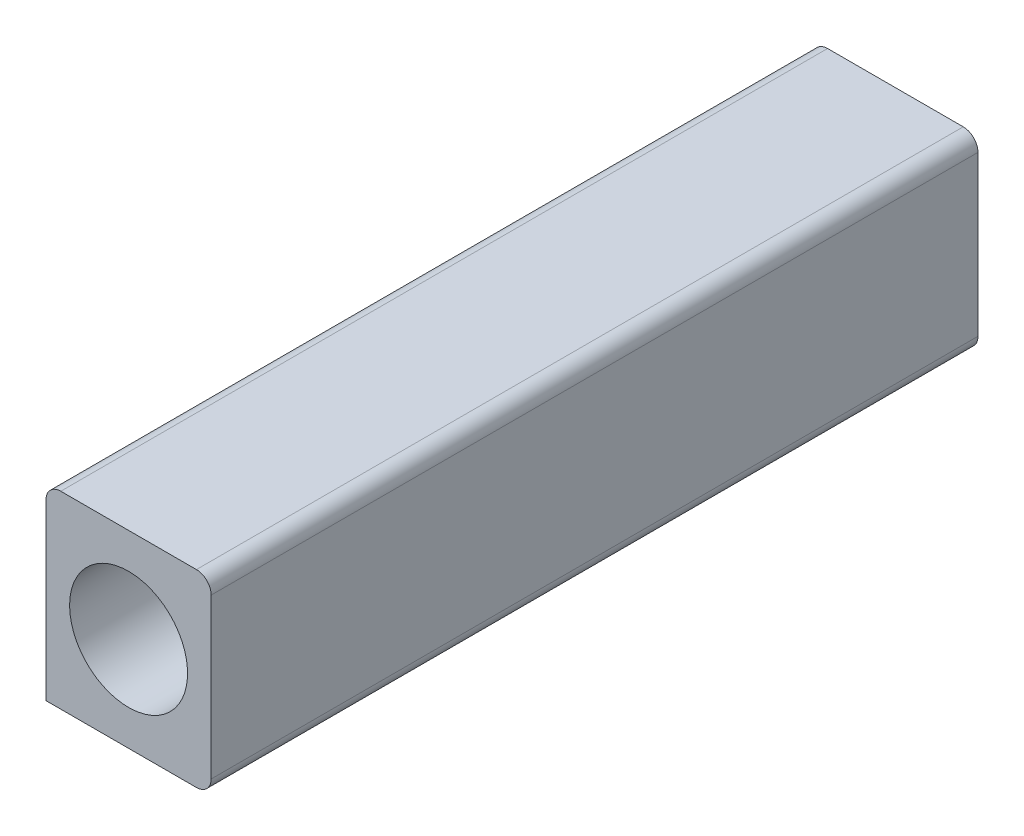
ISO-10303-21;
HEADER;
FILE_DESCRIPTION(('STEP AP214'),'2;1');
FILE_NAME('part.step','',(''),(''),'','','');
FILE_SCHEMA(('AUTOMOTIVE_DESIGN { 1 0 10303 214 1 1 1 1 }'));
ENDSEC;
DATA;
#1=APPLICATION_CONTEXT('core data for automotive mechanical design processes');
#2=APPLICATION_PROTOCOL_DEFINITION('international standard','automotive_design',2000,#1);
#3=PRODUCT_CONTEXT('',#1,'mechanical');
#4=PRODUCT('Part','Part','',(#3));
#5=PRODUCT_RELATED_PRODUCT_CATEGORY('part','',(#4));
#6=PRODUCT_DEFINITION_FORMATION('','',#4);
#7=PRODUCT_DEFINITION_CONTEXT('part definition',#1,'design');
#8=PRODUCT_DEFINITION('design','',#6,#7);
#9=PRODUCT_DEFINITION_SHAPE('','',#8);
#10=(LENGTH_UNIT() NAMED_UNIT(*) SI_UNIT(.MILLI.,.METRE.));
#11=(NAMED_UNIT(*) PLANE_ANGLE_UNIT() SI_UNIT($,.RADIAN.));
#12=(NAMED_UNIT(*) SI_UNIT($,.STERADIAN.) SOLID_ANGLE_UNIT());
#13=UNCERTAINTY_MEASURE_WITH_UNIT(LENGTH_MEASURE(1.E-05),#10,'distance_accuracy_value','');
#14=(GEOMETRIC_REPRESENTATION_CONTEXT(3) GLOBAL_UNCERTAINTY_ASSIGNED_CONTEXT((#13)) GLOBAL_UNIT_ASSIGNED_CONTEXT((#10,
#11,#12)) REPRESENTATION_CONTEXT('',''));
#15=CARTESIAN_POINT('',(0.,0.,0.));
#16=DIRECTION('',(0.,0.,1.));
#17=DIRECTION('',(1.,0.,0.));
#18=AXIS2_PLACEMENT_3D('',#15,#16,#17);
#19=CARTESIAN_POINT('',(-28.,32.,260.));
#20=DIRECTION('',(1.,0.,0.));
#21=DIRECTION('',(0.,0.,-1.));
#22=AXIS2_PLACEMENT_3D('',#19,#20,#21);
#23=PLANE('',#22);
#24=DIRECTION('',(0.,-1.,0.));
#25=VECTOR('',#24,1.);
#26=CARTESIAN_POINT('',(-28.,32.,260.));
#27=LINE('',#26,#25);
#28=CARTESIAN_POINT('',(-28.,27.,260.));
#29=VERTEX_POINT('',#28);
#30=CARTESIAN_POINT('',(-28.,-32.,260.));
#31=VERTEX_POINT('',#30);
#32=EDGE_CURVE('E97',#29,#31,#27,.T.);
#33=ORIENTED_EDGE('',*,*,#32,.F.);
#34=DIRECTION('',(0.,0.,-1.));
#35=VECTOR('',#34,1.);
#36=CARTESIAN_POINT('',(-28.,27.,260.));
#37=LINE('',#36,#35);
#38=CARTESIAN_POINT('',(-28.,27.,0.));
#39=VERTEX_POINT('',#38);
#40=EDGE_CURVE('E144',#29,#39,#37,.T.);
#41=ORIENTED_EDGE('',*,*,#40,.T.);
#42=DIRECTION('',(0.,-1.,0.));
#43=VECTOR('',#42,1.);
#44=CARTESIAN_POINT('',(-28.,32.,0.));
#45=LINE('',#44,#43);
#46=CARTESIAN_POINT('',(-28.,-32.,0.));
#47=VERTEX_POINT('',#46);
#48=EDGE_CURVE('E120',#39,#47,#45,.T.);
#49=ORIENTED_EDGE('',*,*,#48,.T.);
#50=DIRECTION('',(0.,0.,-1.));
#51=VECTOR('',#50,1.);
#52=CARTESIAN_POINT('',(-28.,-32.,260.));
#53=LINE('',#52,#51);
#54=EDGE_CURVE('E114',#31,#47,#53,.T.);
#55=ORIENTED_EDGE('',*,*,#54,.F.);
#56=EDGE_LOOP('',(#33,#41,#49,#55));
#57=FACE_BOUND('',#56,.T.);
#58=ADVANCED_FACE('F39',(#57),#23,.F.);
#59=CARTESIAN_POINT('',(-28.,-32.,260.));
#60=DIRECTION('',(0.,1.,0.));
#61=DIRECTION('',(0.,0.,1.));
#62=AXIS2_PLACEMENT_3D('',#59,#60,#61);
#63=PLANE('',#62);
#64=DIRECTION('',(1.,0.,0.));
#65=VECTOR('',#64,1.);
#66=CARTESIAN_POINT('',(-28.,-32.,0.));
#67=LINE('',#66,#65);
#68=CARTESIAN_POINT('',(23.,-32.,0.));
#69=VERTEX_POINT('',#68);
#70=EDGE_CURVE('E155',#47,#69,#67,.T.);
#71=ORIENTED_EDGE('',*,*,#70,.T.);
#72=DIRECTION('',(0.,0.,-1.));
#73=VECTOR('',#72,1.);
#74=CARTESIAN_POINT('',(23.,-32.,260.));
#75=LINE('',#74,#73);
#76=CARTESIAN_POINT('',(23.,-32.,260.));
#77=VERTEX_POINT('',#76);
#78=EDGE_CURVE('E116',#69,#77,#75,.F.);
#79=ORIENTED_EDGE('',*,*,#78,.T.);
#80=DIRECTION('',(1.,0.,0.));
#81=VECTOR('',#80,1.);
#82=CARTESIAN_POINT('',(-28.,-32.,260.));
#83=LINE('',#82,#81);
#84=EDGE_CURVE('E100',#31,#77,#83,.T.);
#85=ORIENTED_EDGE('',*,*,#84,.F.);
#86=ORIENTED_EDGE('',*,*,#54,.T.);
#87=EDGE_LOOP('',(#71,#79,#85,#86));
#88=FACE_BOUND('',#87,.T.);
#89=ADVANCED_FACE('F113',(#88),#63,.F.);
#90=CARTESIAN_POINT('',(28.,-32.,260.));
#91=DIRECTION('',(-1.,0.,0.));
#92=DIRECTION('',(0.,0.,1.));
#93=AXIS2_PLACEMENT_3D('',#90,#91,#92);
#94=PLANE('',#93);
#95=DIRECTION('',(0.,1.,0.));
#96=VECTOR('',#95,1.);
#97=CARTESIAN_POINT('',(28.,-32.,260.));
#98=LINE('',#97,#96);
#99=CARTESIAN_POINT('',(28.,-27.,260.));
#100=VERTEX_POINT('',#99);
#101=CARTESIAN_POINT('',(28.,27.,260.));
#102=VERTEX_POINT('',#101);
#103=EDGE_CURVE('E117',#100,#102,#98,.T.);
#104=ORIENTED_EDGE('',*,*,#103,.F.);
#105=DIRECTION('',(0.,0.,-1.));
#106=VECTOR('',#105,1.);
#107=CARTESIAN_POINT('',(28.,-27.,260.));
#108=LINE('',#107,#106);
#109=CARTESIAN_POINT('',(28.,-27.,0.));
#110=VERTEX_POINT('',#109);
#111=EDGE_CURVE('E125',#100,#110,#108,.T.);
#112=ORIENTED_EDGE('',*,*,#111,.T.);
#113=DIRECTION('',(0.,1.,0.));
#114=VECTOR('',#113,1.);
#115=CARTESIAN_POINT('',(28.,-32.,0.));
#116=LINE('',#115,#114);
#117=CARTESIAN_POINT('',(28.,27.,0.));
#118=VERTEX_POINT('',#117);
#119=EDGE_CURVE('E154',#110,#118,#116,.T.);
#120=ORIENTED_EDGE('',*,*,#119,.T.);
#121=DIRECTION('',(0.,0.,-1.));
#122=VECTOR('',#121,1.);
#123=CARTESIAN_POINT('',(28.,27.,260.));
#124=LINE('',#123,#122);
#125=EDGE_CURVE('E122',#118,#102,#124,.F.);
#126=ORIENTED_EDGE('',*,*,#125,.T.);
#127=EDGE_LOOP('',(#104,#112,#120,#126));
#128=FACE_BOUND('',#127,.T.);
#129=ADVANCED_FACE('F190',(#128),#94,.F.);
#130=CARTESIAN_POINT('',(28.,32.,260.));
#131=DIRECTION('',(0.,-1.,0.));
#132=DIRECTION('',(0.,0.,-1.));
#133=AXIS2_PLACEMENT_3D('',#130,#131,#132);
#134=PLANE('',#133);
#135=DIRECTION('',(-1.,0.,0.));
#136=VECTOR('',#135,1.);
#137=CARTESIAN_POINT('',(28.,32.,0.));
#138=LINE('',#137,#136);
#139=CARTESIAN_POINT('',(23.,32.,0.));
#140=VERTEX_POINT('',#139);
#141=CARTESIAN_POINT('',(-23.,32.,0.));
#142=VERTEX_POINT('',#141);
#143=EDGE_CURVE('E108',#140,#142,#138,.T.);
#144=ORIENTED_EDGE('',*,*,#143,.T.);
#145=DIRECTION('',(0.,0.,-1.));
#146=VECTOR('',#145,1.);
#147=CARTESIAN_POINT('',(-23.,32.,260.));
#148=LINE('',#147,#146);
#149=CARTESIAN_POINT('',(-23.,32.,260.));
#150=VERTEX_POINT('',#149);
#151=EDGE_CURVE('E11',#142,#150,#148,.F.);
#152=ORIENTED_EDGE('',*,*,#151,.T.);
#153=DIRECTION('',(-1.,0.,0.));
#154=VECTOR('',#153,1.);
#155=CARTESIAN_POINT('',(28.,32.,260.));
#156=LINE('',#155,#154);
#157=CARTESIAN_POINT('',(23.,32.,260.));
#158=VERTEX_POINT('',#157);
#159=EDGE_CURVE('E123',#158,#150,#156,.T.);
#160=ORIENTED_EDGE('',*,*,#159,.F.);
#161=DIRECTION('',(0.,0.,-1.));
#162=VECTOR('',#161,1.);
#163=CARTESIAN_POINT('',(23.,32.,260.));
#164=LINE('',#163,#162);
#165=EDGE_CURVE('E47',#158,#140,#164,.T.);
#166=ORIENTED_EDGE('',*,*,#165,.T.);
#167=EDGE_LOOP('',(#144,#152,#160,#166));
#168=FACE_BOUND('',#167,.T.);
#169=ADVANCED_FACE('F148',(#168),#134,.F.);
#170=CARTESIAN_POINT('',(0.,0.,260.));
#171=DIRECTION('',(0.,0.,1.));
#172=DIRECTION('',(1.,0.,0.));
#173=AXIS2_PLACEMENT_3D('',#170,#171,#172);
#174=PLANE('',#173);
#175=CARTESIAN_POINT('',(0.,0.,260.));
#176=DIRECTION('',(0.,0.,-1.));
#177=DIRECTION('',(-1.,0.,0.));
#178=AXIS2_PLACEMENT_3D('',#175,#176,#177);
#179=CIRCLE('',#178,20.);
#180=CARTESIAN_POINT('',(-20.,0.,260.));
#181=VERTEX_POINT('',#180);
#182=EDGE_CURVE('E160',#181,#181,#179,.T.);
#183=ORIENTED_EDGE('',*,*,#182,.T.);
#184=EDGE_LOOP('',(#183));
#185=FACE_BOUND('',#184,.T.);
#186=ORIENTED_EDGE('',*,*,#84,.T.);
#187=CARTESIAN_POINT('',(23.,-27.,260.));
#188=DIRECTION('',(0.,0.,1.));
#189=DIRECTION('',(1.,0.,0.));
#190=AXIS2_PLACEMENT_3D('',#187,#188,#189);
#191=CIRCLE('',#190,5.);
#192=EDGE_CURVE('E142',#77,#100,#191,.T.);
#193=ORIENTED_EDGE('',*,*,#192,.T.);
#194=ORIENTED_EDGE('',*,*,#103,.T.);
#195=CARTESIAN_POINT('',(23.,27.,260.));
#196=DIRECTION('',(0.,0.,1.));
#197=DIRECTION('',(1.,0.,0.));
#198=AXIS2_PLACEMENT_3D('',#195,#196,#197);
#199=CIRCLE('',#198,5.);
#200=EDGE_CURVE('E59',#102,#158,#199,.T.);
#201=ORIENTED_EDGE('',*,*,#200,.T.);
#202=ORIENTED_EDGE('',*,*,#159,.T.);
#203=CARTESIAN_POINT('',(-23.,27.,260.));
#204=DIRECTION('',(0.,0.,1.));
#205=DIRECTION('',(1.,0.,0.));
#206=AXIS2_PLACEMENT_3D('',#203,#204,#205);
#207=CIRCLE('',#206,5.);
#208=EDGE_CURVE('E103',#150,#29,#207,.T.);
#209=ORIENTED_EDGE('',*,*,#208,.T.);
#210=ORIENTED_EDGE('',*,*,#32,.T.);
#211=EDGE_LOOP('',(#186,#193,#194,#201,#202,#209,#210));
#212=FACE_BOUND('',#211,.T.);
#213=ADVANCED_FACE('F99',(#185,#212),#174,.T.);
#214=CARTESIAN_POINT('',(0.,0.,0.));
#215=DIRECTION('',(0.,0.,1.));
#216=DIRECTION('',(1.,0.,0.));
#217=AXIS2_PLACEMENT_3D('',#214,#215,#216);
#218=PLANE('',#217);
#219=CARTESIAN_POINT('',(0.,0.,0.));
#220=DIRECTION('',(0.,0.,-1.));
#221=DIRECTION('',(-1.,0.,0.));
#222=AXIS2_PLACEMENT_3D('',#219,#220,#221);
#223=CIRCLE('',#222,20.);
#224=CARTESIAN_POINT('',(-20.,0.,0.));
#225=VERTEX_POINT('',#224);
#226=EDGE_CURVE('E163',#225,#225,#223,.T.);
#227=ORIENTED_EDGE('',*,*,#226,.F.);
#228=EDGE_LOOP('',(#227));
#229=FACE_BOUND('',#228,.T.);
#230=ORIENTED_EDGE('',*,*,#119,.F.);
#231=CARTESIAN_POINT('',(23.,-27.,0.));
#232=DIRECTION('',(0.,0.,1.));
#233=DIRECTION('',(1.,0.,0.));
#234=AXIS2_PLACEMENT_3D('',#231,#232,#233);
#235=CIRCLE('',#234,5.);
#236=EDGE_CURVE('E137',#110,#69,#235,.F.);
#237=ORIENTED_EDGE('',*,*,#236,.T.);
#238=ORIENTED_EDGE('',*,*,#70,.F.);
#239=ORIENTED_EDGE('',*,*,#48,.F.);
#240=CARTESIAN_POINT('',(-23.,27.,0.));
#241=DIRECTION('',(0.,0.,1.));
#242=DIRECTION('',(1.,0.,0.));
#243=AXIS2_PLACEMENT_3D('',#240,#241,#242);
#244=CIRCLE('',#243,5.);
#245=EDGE_CURVE('E135',#39,#142,#244,.F.);
#246=ORIENTED_EDGE('',*,*,#245,.T.);
#247=ORIENTED_EDGE('',*,*,#143,.F.);
#248=CARTESIAN_POINT('',(23.,27.,0.));
#249=DIRECTION('',(0.,0.,1.));
#250=DIRECTION('',(1.,0.,0.));
#251=AXIS2_PLACEMENT_3D('',#248,#249,#250);
#252=CIRCLE('',#251,5.);
#253=EDGE_CURVE('E133',#140,#118,#252,.F.);
#254=ORIENTED_EDGE('',*,*,#253,.T.);
#255=EDGE_LOOP('',(#230,#237,#238,#239,#246,#247,#254));
#256=FACE_BOUND('',#255,.T.);
#257=ADVANCED_FACE('F152',(#229,#256),#218,.F.);
#258=CARTESIAN_POINT('',(0.,0.,260.));
#259=DIRECTION('',(0.,0.,-1.));
#260=DIRECTION('',(-1.,0.,0.));
#261=AXIS2_PLACEMENT_3D('',#258,#259,#260);
#262=CYLINDRICAL_SURFACE('',#261,20.);
#263=ORIENTED_EDGE('',*,*,#182,.F.);
#264=EDGE_LOOP('',(#263));
#265=FACE_BOUND('',#264,.T.);
#266=ORIENTED_EDGE('',*,*,#226,.T.);
#267=EDGE_LOOP('',(#266));
#268=FACE_BOUND('',#267,.T.);
#269=ADVANCED_FACE('F170',(#265,#268),#262,.F.);
#270=CARTESIAN_POINT('',(23.,-27.,260.));
#271=DIRECTION('',(0.,0.,-1.));
#272=DIRECTION('',(-1.,0.,0.));
#273=AXIS2_PLACEMENT_3D('',#270,#271,#272);
#274=CYLINDRICAL_SURFACE('',#273,5.);
#275=ORIENTED_EDGE('',*,*,#192,.F.);
#276=ORIENTED_EDGE('',*,*,#78,.F.);
#277=ORIENTED_EDGE('',*,*,#236,.F.);
#278=ORIENTED_EDGE('',*,*,#111,.F.);
#279=EDGE_LOOP('',(#275,#276,#277,#278));
#280=FACE_BOUND('',#279,.T.);
#281=ADVANCED_FACE('F173',(#280),#274,.T.);
#282=CARTESIAN_POINT('',(-23.,27.,260.));
#283=DIRECTION('',(0.,0.,-1.));
#284=DIRECTION('',(-1.,0.,0.));
#285=AXIS2_PLACEMENT_3D('',#282,#283,#284);
#286=CYLINDRICAL_SURFACE('',#285,5.);
#287=ORIENTED_EDGE('',*,*,#208,.F.);
#288=ORIENTED_EDGE('',*,*,#151,.F.);
#289=ORIENTED_EDGE('',*,*,#245,.F.);
#290=ORIENTED_EDGE('',*,*,#40,.F.);
#291=EDGE_LOOP('',(#287,#288,#289,#290));
#292=FACE_BOUND('',#291,.T.);
#293=ADVANCED_FACE('F194',(#292),#286,.T.);
#294=CARTESIAN_POINT('',(23.,27.,260.));
#295=DIRECTION('',(0.,0.,-1.));
#296=DIRECTION('',(-1.,0.,0.));
#297=AXIS2_PLACEMENT_3D('',#294,#295,#296);
#298=CYLINDRICAL_SURFACE('',#297,5.);
#299=ORIENTED_EDGE('',*,*,#200,.F.);
#300=ORIENTED_EDGE('',*,*,#125,.F.);
#301=ORIENTED_EDGE('',*,*,#253,.F.);
#302=ORIENTED_EDGE('',*,*,#165,.F.);
#303=EDGE_LOOP('',(#299,#300,#301,#302));
#304=FACE_BOUND('',#303,.T.);
#305=ADVANCED_FACE('F41',(#304),#298,.T.);
#306=CLOSED_SHELL('',(#58,#89,#129,#169,#213,#257,#269,#281,#293,#305));
#307=MANIFOLD_SOLID_BREP('B2',#306);
#308=ADVANCED_BREP_SHAPE_REPRESENTATION('',(#18,#307),#14);
#309=SHAPE_DEFINITION_REPRESENTATION(#9,#308);
ENDSEC;
END-ISO-10303-21;
